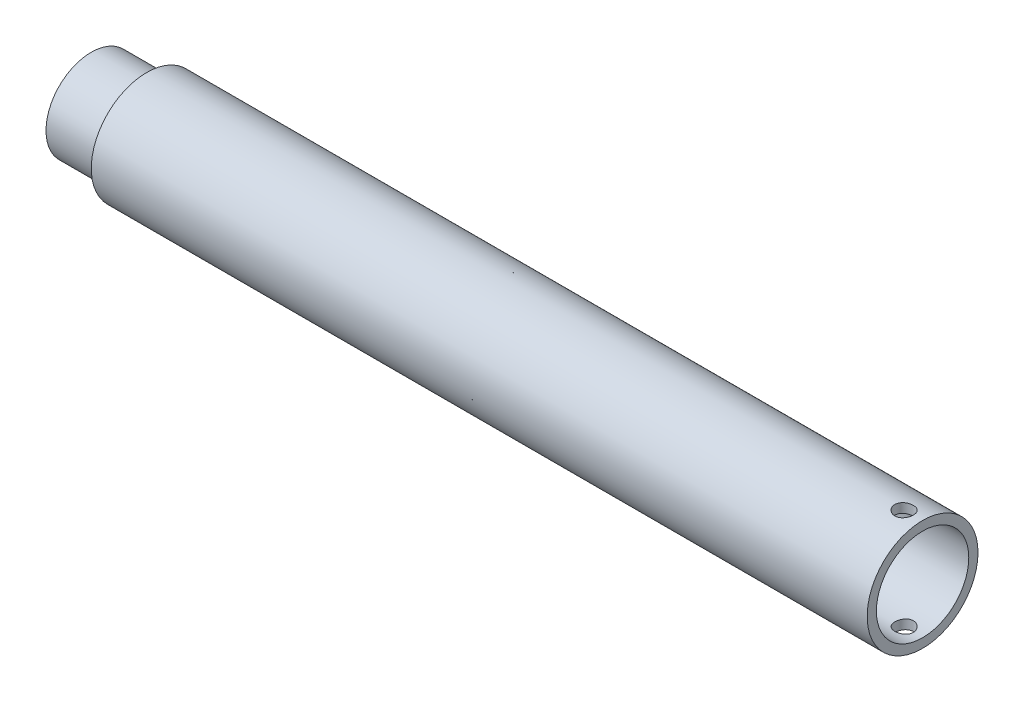
ISO-10303-21;
HEADER;
FILE_DESCRIPTION(('STEP AP214'),'2;1');
FILE_NAME('part.step','',(''),(''),'','','');
FILE_SCHEMA(('AUTOMOTIVE_DESIGN { 1 0 10303 214 1 1 1 1 }'));
ENDSEC;
DATA;
#1=APPLICATION_CONTEXT('core data for automotive mechanical design processes');
#2=APPLICATION_PROTOCOL_DEFINITION('international standard','automotive_design',2000,#1);
#3=PRODUCT_CONTEXT('',#1,'mechanical');
#4=PRODUCT('Part','Part','',(#3));
#5=PRODUCT_RELATED_PRODUCT_CATEGORY('part','',(#4));
#6=PRODUCT_DEFINITION_FORMATION('','',#4);
#7=PRODUCT_DEFINITION_CONTEXT('part definition',#1,'design');
#8=PRODUCT_DEFINITION('design','',#6,#7);
#9=PRODUCT_DEFINITION_SHAPE('','',#8);
#10=(LENGTH_UNIT() NAMED_UNIT(*) SI_UNIT(.MILLI.,.METRE.));
#11=(NAMED_UNIT(*) PLANE_ANGLE_UNIT() SI_UNIT($,.RADIAN.));
#12=(NAMED_UNIT(*) SI_UNIT($,.STERADIAN.) SOLID_ANGLE_UNIT());
#13=UNCERTAINTY_MEASURE_WITH_UNIT(LENGTH_MEASURE(1.E-05),#10,'distance_accuracy_value','');
#14=(GEOMETRIC_REPRESENTATION_CONTEXT(3) GLOBAL_UNCERTAINTY_ASSIGNED_CONTEXT((#13)) GLOBAL_UNIT_ASSIGNED_CONTEXT((#10,
#11,#12)) REPRESENTATION_CONTEXT('',''));
#15=CARTESIAN_POINT('',(0.,0.,0.));
#16=DIRECTION('',(0.,0.,1.));
#17=DIRECTION('',(1.,0.,0.));
#18=AXIS2_PLACEMENT_3D('',#15,#16,#17);
#19=CARTESIAN_POINT('',(0.,0.,0.));
#20=DIRECTION('',(-1.,0.,0.));
#21=DIRECTION('',(0.,0.,1.));
#22=AXIS2_PLACEMENT_3D('',#19,#20,#21);
#23=PLANE('',#22);
#24=CARTESIAN_POINT('',(0.,0.,0.));
#25=DIRECTION('',(-1.,0.,0.));
#26=DIRECTION('',(0.,0.,1.));
#27=AXIS2_PLACEMENT_3D('',#24,#25,#26);
#28=CIRCLE('',#27,12.25);
#29=CARTESIAN_POINT('',(0.,0.,12.25));
#30=VERTEX_POINT('',#29);
#31=EDGE_CURVE('E11',#30,#30,#28,.F.);
#32=ORIENTED_EDGE('',*,*,#31,.T.);
#33=EDGE_LOOP('',(#32));
#34=FACE_BOUND('',#33,.T.);
#35=CARTESIAN_POINT('',(0.,0.,0.));
#36=DIRECTION('',(1.,0.,0.));
#37=DIRECTION('',(0.,0.,-1.));
#38=AXIS2_PLACEMENT_3D('',#35,#36,#37);
#39=CIRCLE('',#38,15.);
#40=CARTESIAN_POINT('',(0.,0.,-15.));
#41=VERTEX_POINT('',#40);
#42=EDGE_CURVE('E78',#41,#41,#39,.T.);
#43=ORIENTED_EDGE('',*,*,#42,.F.);
#44=EDGE_LOOP('',(#43));
#45=FACE_BOUND('',#44,.T.);
#46=ADVANCED_FACE('F47',(#34,#45),#23,.T.);
#47=CARTESIAN_POINT('',(5.,0.,0.));
#48=DIRECTION('',(-1.,0.,0.));
#49=DIRECTION('',(0.,0.,1.));
#50=AXIS2_PLACEMENT_3D('',#47,#48,#49);
#51=CYLINDRICAL_SURFACE('',#50,12.25);
#52=ORIENTED_EDGE('',*,*,#31,.F.);
#53=EDGE_LOOP('',(#52));
#54=FACE_BOUND('',#53,.T.);
#55=CARTESIAN_POINT('',(-15.,0.,0.));
#56=DIRECTION('',(-1.,0.,0.));
#57=DIRECTION('',(0.,0.,1.));
#58=AXIS2_PLACEMENT_3D('',#55,#56,#57);
#59=CIRCLE('',#58,12.25);
#60=CARTESIAN_POINT('',(-15.,0.,12.25));
#61=VERTEX_POINT('',#60);
#62=EDGE_CURVE('E59',#61,#61,#59,.T.);
#63=ORIENTED_EDGE('',*,*,#62,.F.);
#64=EDGE_LOOP('',(#63));
#65=FACE_BOUND('',#64,.T.);
#66=ADVANCED_FACE('F51',(#54,#65),#51,.T.);
#67=CARTESIAN_POINT('',(-15.,0.,0.));
#68=DIRECTION('',(-1.,0.,0.));
#69=DIRECTION('',(0.,0.,1.));
#70=AXIS2_PLACEMENT_3D('',#67,#68,#69);
#71=PLANE('',#70);
#72=CARTESIAN_POINT('',(-15.,0.,0.));
#73=DIRECTION('',(-1.,0.,0.));
#74=DIRECTION('',(0.,0.,1.));
#75=AXIS2_PLACEMENT_3D('',#72,#73,#74);
#76=CIRCLE('',#75,10.);
#77=CARTESIAN_POINT('',(-15.,0.,10.));
#78=VERTEX_POINT('',#77);
#79=EDGE_CURVE('E61',#78,#78,#76,.T.);
#80=ORIENTED_EDGE('',*,*,#79,.F.);
#81=EDGE_LOOP('',(#80));
#82=FACE_BOUND('',#81,.T.);
#83=ORIENTED_EDGE('',*,*,#62,.T.);
#84=EDGE_LOOP('',(#83));
#85=FACE_BOUND('',#84,.T.);
#86=ADVANCED_FACE('F142',(#82,#85),#71,.T.);
#87=CARTESIAN_POINT('',(5.,0.,0.));
#88=DIRECTION('',(-1.,0.,0.));
#89=DIRECTION('',(0.,0.,1.));
#90=AXIS2_PLACEMENT_3D('',#87,#88,#89);
#91=CYLINDRICAL_SURFACE('',#90,10.);
#92=ORIENTED_EDGE('',*,*,#79,.T.);
#93=EDGE_LOOP('',(#92));
#94=FACE_BOUND('',#93,.T.);
#95=CARTESIAN_POINT('',(10.,0.,0.));
#96=DIRECTION('',(-1.,0.,0.));
#97=DIRECTION('',(0.,0.,1.));
#98=AXIS2_PLACEMENT_3D('',#95,#96,#97);
#99=CIRCLE('',#98,10.);
#100=CARTESIAN_POINT('',(10.,0.,10.));
#101=VERTEX_POINT('',#100);
#102=EDGE_CURVE('E52',#101,#101,#99,.T.);
#103=ORIENTED_EDGE('',*,*,#102,.F.);
#104=EDGE_LOOP('',(#103));
#105=FACE_BOUND('',#104,.T.);
#106=ADVANCED_FACE('F138',(#94,#105),#91,.F.);
#107=CARTESIAN_POINT('',(210.,0.,0.));
#108=DIRECTION('',(-1.,0.,0.));
#109=DIRECTION('',(0.,0.,1.));
#110=AXIS2_PLACEMENT_3D('',#107,#108,#109);
#111=CYLINDRICAL_SURFACE('',#110,12.5);
#112=CARTESIAN_POINT('',(205.,12.2474487139159,-2.5));
#113=CARTESIAN_POINT('',(204.861089061272,12.2474514756662,-2.49999486468817));
#114=CARTESIAN_POINT('',(204.722113441667,12.2498377067175,-2.48838292929536));
#115=CARTESIAN_POINT('',(204.448093737142,12.2591107826219,-2.4422807089571));
#116=CARTESIAN_POINT('',(204.31305288841,12.2660012286197,-2.40777211767623));
#117=CARTESIAN_POINT('',(204.050906741614,12.2834718430464,-2.31698945654936));
#118=CARTESIAN_POINT('',(203.923793696169,12.2940483405269,-2.26073703538156));
#119=CARTESIAN_POINT('',(203.680812888258,12.3176949870165,-2.12812276917627));
#120=CARTESIAN_POINT('',(203.564944498655,12.3307649968365,-2.05176204650288));
#121=CARTESIAN_POINT('',(203.346097490365,12.3581324923563,-1.87994768913359));
#122=CARTESIAN_POINT('',(203.24330103029,12.3724434459312,-1.7842641397833));
#123=CARTESIAN_POINT('',(203.055106166053,12.400561807565,-1.57701697255328));
#124=CARTESIAN_POINT('',(202.969708981457,12.4143691802708,-1.46545224244496));
#125=CARTESIAN_POINT('',(202.818029955929,12.4400699104391,-1.22840338981063));
#126=CARTESIAN_POINT('',(202.751921215458,12.4519455360388,-1.10280641918052));
#127=CARTESIAN_POINT('',(202.64181265738,12.4722934220908,-0.842010375968175));
#128=CARTESIAN_POINT('',(202.597810770247,12.480766001103,-0.706812203551388));
#129=CARTESIAN_POINT('',(202.533732015951,12.4932580172105,-0.432541933196249));
#130=CARTESIAN_POINT('',(202.513347556072,12.4973346572032,-0.293544348037046));
#131=CARTESIAN_POINT('',(202.496122620404,12.5007730295901,-0.0140464210938512));
#132=CARTESIAN_POINT('',(202.499279875885,12.500135216319,0.126453774579596));
#133=CARTESIAN_POINT('',(202.528815450539,12.4942608717129,0.402855001858956));
#134=CARTESIAN_POINT('',(202.55486244292,12.489089959146,0.538793035746158));
#135=CARTESIAN_POINT('',(202.628912581147,12.4748044289852,0.804329066450734));
#136=CARTESIAN_POINT('',(202.67691660548,12.465689653601,0.933926809367804));
#137=CARTESIAN_POINT('',(202.793825100368,12.444432400499,1.1840486580022));
#138=CARTESIAN_POINT('',(202.862859377762,12.4322712043806,1.30451043533474));
#139=CARTESIAN_POINT('',(203.019772693091,12.4062617368446,1.53226261464938));
#140=CARTESIAN_POINT('',(203.107653899426,12.3924132713806,1.63955149881249));
#141=CARTESIAN_POINT('',(203.301584055271,12.3642741091115,1.83987857763363));
#142=CARTESIAN_POINT('',(203.407922966824,12.3499799114379,1.93263579143407));
#143=CARTESIAN_POINT('',(203.634791106127,12.322789289969,2.09904623294202));
#144=CARTESIAN_POINT('',(203.755320602208,12.3098928926137,2.17269909931937));
#145=CARTESIAN_POINT('',(204.007552079554,12.2869511868231,2.2989070370047));
#146=CARTESIAN_POINT('',(204.139277419099,12.2769120390887,2.35141661944427));
#147=CARTESIAN_POINT('',(204.40992830931,12.2609119080318,2.43347585406895));
#148=CARTESIAN_POINT('',(204.548852919048,12.2549503932107,2.4630284986416));
#149=CARTESIAN_POINT('',(204.827412144998,12.2478869816957,2.49791501509012));
#150=CARTESIAN_POINT('',(204.966993935776,12.2467036764289,2.50365464724478));
#151=CARTESIAN_POINT('',(205.245120557999,12.2491121422213,2.49184407077684));
#152=CARTESIAN_POINT('',(205.383665447797,12.2527036425097,2.4742951828061));
#153=CARTESIAN_POINT('',(205.654421600731,12.2641808123729,2.41675552018539));
#154=CARTESIAN_POINT('',(205.786680857589,12.2720249753624,2.37698155209825));
#155=CARTESIAN_POINT('',(206.042658197572,12.2910872337916,2.27635258827129));
#156=CARTESIAN_POINT('',(206.166375576089,12.3023056071567,2.21549585593293));
#157=CARTESIAN_POINT('',(206.403532774875,12.327035149051,2.07351035553898));
#158=CARTESIAN_POINT('',(206.516817615752,12.3405742966226,1.99212769495687));
#159=CARTESIAN_POINT('',(206.728270780002,12.3683430956659,1.81173893053177));
#160=CARTESIAN_POINT('',(206.826437545623,12.3825728180955,1.71273101286133));
#161=CARTESIAN_POINT('',(207.006406397964,12.4103836467304,1.49808068374472));
#162=CARTESIAN_POINT('',(207.087934136625,12.4239514427171,1.38220624732407));
#163=CARTESIAN_POINT('',(207.230364703749,12.4486781907155,1.13816974158689));
#164=CARTESIAN_POINT('',(207.291268398362,12.4598372438803,1.01000818858377));
#165=CARTESIAN_POINT('',(207.390322179367,12.4784323515267,0.745756702060042));
#166=CARTESIAN_POINT('',(207.428601295566,12.4858894785651,0.609716683695206));
#167=CARTESIAN_POINT('',(207.48172811916,12.4963308984415,0.33297363669979));
#168=CARTESIAN_POINT('',(207.496578648689,12.4993157299962,0.192271171778041));
#169=CARTESIAN_POINT('',(207.502317452407,12.5004635113529,-0.0871822347590421));
#170=CARTESIAN_POINT('',(207.493618201141,12.4987094637332,-0.225924530353726));
#171=CARTESIAN_POINT('',(207.45341512363,12.4907510890085,-0.499927578289116));
#172=CARTESIAN_POINT('',(207.42191158413,12.4845468178608,-0.635188374384297));
#173=CARTESIAN_POINT('',(207.337177519771,12.468387459123,-0.898131874362646));
#174=CARTESIAN_POINT('',(207.283996554673,12.4584409311904,-1.02583110810039));
#175=CARTESIAN_POINT('',(207.157469396672,12.435868053092,-1.27055305046515));
#176=CARTESIAN_POINT('',(207.084121610239,12.4232414911747,-1.3875749144196));
#177=CARTESIAN_POINT('',(206.917951532347,12.3964399789185,-1.60965972526477));
#178=CARTESIAN_POINT('',(206.824834159041,12.3822433354475,-1.71449929028708));
#179=CARTESIAN_POINT('',(206.622374399753,12.3540305726966,-1.90720654439625));
#180=CARTESIAN_POINT('',(206.5130281763,12.340014496968,-1.99507020802227));
#181=CARTESIAN_POINT('',(206.279801708274,12.3135835683483,-2.15223054862494));
#182=CARTESIAN_POINT('',(206.155777597197,12.3011875892806,-2.22131703654521));
#183=CARTESIAN_POINT('',(205.89766806685,12.2796309281603,-2.33756012316556));
#184=CARTESIAN_POINT('',(205.763591903282,12.2704673131246,-2.3847366149354));
#185=CARTESIAN_POINT('',(205.524343861393,12.2582420284461,-2.44667284964413));
#186=CARTESIAN_POINT('',(205.420536451215,12.2542196228652,-2.4666347463092));
#187=CARTESIAN_POINT('',(205.211165113622,12.2488219614771,-2.49330004489927));
#188=CARTESIAN_POINT('',(205.105601246889,12.2474466144105,-2.5000039039066));
#189=CARTESIAN_POINT('',(205.,12.2474487139159,-2.5));
#190=B_SPLINE_CURVE_WITH_KNOTS('',3,(#112,#113,#114,#115,#116,#117,#118,#119,#120,#121,#122,
#123,#124,#125,#126,#127,#128,#129,#130,#131,#132,#133,#134,#135,#136,#137,#138,#139,#140,#141,
#142,#143,#144,#145,#146,#147,#148,#149,#150,#151,#152,#153,#154,#155,#156,#157,#158,#159,#160,
#161,#162,#163,#164,#165,#166,#167,#168,#169,#170,#171,#172,#173,#174,#175,#176,#177,#178,#179,
#180,#181,#182,#183,#184,#185,#186,#187,#188,#189),.UNSPECIFIED.,.T.,.F.,(4,2,2,2,2,2,2,2,2,2,2,
2,2,2,2,2,2,2,2,2,2,2,2,2,2,2,2,2,2,2,2,2,2,2,2,2,2,2,4),(0.,0.416346159673539,
0.833025598210731,1.24929124485145,1.66553366214964,2.08705631371092,2.50860850088555,
2.93383501093626,3.35902170616398,3.77860622207699,4.19815030290619,4.61171974083841,
5.02530572684374,5.44149810555756,5.85773839425164,6.28123366906206,6.70473695306801,
7.12914657931941,7.55350087540059,7.97059394511484,8.38766336321051,8.80073354458296,
9.21383775885995,9.63232649436305,10.0508583217552,10.4758150433362,10.9007539157526,
11.3232453394662,11.7456858672907,12.1607754353671,12.5758597841689,12.9900004268863,
13.4041738033671,13.8250288006399,14.2459834722445,14.6714724644901,15.0965743772549,
15.413095090954,15.729604892137),.UNSPECIFIED.);
#191=CARTESIAN_POINT('',(205.,12.2474487139159,-2.5));
#192=VERTEX_POINT('',#191);
#193=EDGE_CURVE('E100',#192,#192,#190,.T.);
#194=ORIENTED_EDGE('',*,*,#193,.T.);
#195=EDGE_LOOP('',(#194));
#196=FACE_BOUND('',#195,.T.);
#197=CARTESIAN_POINT('',(210.,0.,0.));
#198=DIRECTION('',(1.,0.,0.));
#199=DIRECTION('',(0.,0.,-1.));
#200=AXIS2_PLACEMENT_3D('',#197,#198,#199);
#201=CIRCLE('',#200,12.5);
#202=CARTESIAN_POINT('',(210.,0.,-12.5));
#203=VERTEX_POINT('',#202);
#204=EDGE_CURVE('E86',#203,#203,#201,.T.);
#205=ORIENTED_EDGE('',*,*,#204,.T.);
#206=EDGE_LOOP('',(#205));
#207=FACE_BOUND('',#206,.T.);
#208=CARTESIAN_POINT('',(205.,-12.2474487139159,-2.5));
#209=CARTESIAN_POINT('',(205.138910938728,-12.2474514756662,-2.49999486468817));
#210=CARTESIAN_POINT('',(205.277886558333,-12.2498377067175,-2.48838292929536));
#211=CARTESIAN_POINT('',(205.551906262858,-12.2591107826219,-2.4422807089571));
#212=CARTESIAN_POINT('',(205.68694711159,-12.2660012286197,-2.40777211767623));
#213=CARTESIAN_POINT('',(205.949093258385,-12.2834718430464,-2.31698945654936));
#214=CARTESIAN_POINT('',(206.076206303831,-12.2940483405269,-2.26073703538156));
#215=CARTESIAN_POINT('',(206.319187111742,-12.3176949870165,-2.12812276917627));
#216=CARTESIAN_POINT('',(206.435055501345,-12.3307649968365,-2.05176204650288));
#217=CARTESIAN_POINT('',(206.653902509635,-12.3581324923563,-1.87994768913359));
#218=CARTESIAN_POINT('',(206.75669896971,-12.3724434459312,-1.7842641397833));
#219=CARTESIAN_POINT('',(206.944893833947,-12.400561807565,-1.57701697255328));
#220=CARTESIAN_POINT('',(207.030291018543,-12.4143691802708,-1.46545224244496));
#221=CARTESIAN_POINT('',(207.181970044071,-12.440069910439,-1.22840338981064));
#222=CARTESIAN_POINT('',(207.248078784542,-12.4519455360388,-1.10280641918053));
#223=CARTESIAN_POINT('',(207.35818734262,-12.4722934220908,-0.84201037596819));
#224=CARTESIAN_POINT('',(207.402189229752,-12.480766001103,-0.706812203551395));
#225=CARTESIAN_POINT('',(207.466267984049,-12.4932580172105,-0.43254193319625));
#226=CARTESIAN_POINT('',(207.486652443927,-12.4973346572032,-0.29354434803705));
#227=CARTESIAN_POINT('',(207.503877379596,-12.5007730295901,-0.0140464210938544));
#228=CARTESIAN_POINT('',(207.500720124115,-12.500135216319,0.126453774579596));
#229=CARTESIAN_POINT('',(207.471184549461,-12.4942608717129,0.402855001858959));
#230=CARTESIAN_POINT('',(207.44513755708,-12.489089959146,0.538793035746161));
#231=CARTESIAN_POINT('',(207.371087418853,-12.4748044289852,0.804329066450737));
#232=CARTESIAN_POINT('',(207.32308339452,-12.465689653601,0.933926809367807));
#233=CARTESIAN_POINT('',(207.206174899632,-12.444432400499,1.18404865800221));
#234=CARTESIAN_POINT('',(207.137140622238,-12.4322712043806,1.30451043533474));
#235=CARTESIAN_POINT('',(206.980227306908,-12.4062617368446,1.53226261464938));
#236=CARTESIAN_POINT('',(206.892346100574,-12.3924132713806,1.63955149881249));
#237=CARTESIAN_POINT('',(206.698415944729,-12.3642741091115,1.83987857763363));
#238=CARTESIAN_POINT('',(206.592077033176,-12.3499799114379,1.93263579143407));
#239=CARTESIAN_POINT('',(206.365208893873,-12.322789289969,2.09904623294202));
#240=CARTESIAN_POINT('',(206.244679397792,-12.3098928926137,2.17269909931937));
#241=CARTESIAN_POINT('',(205.992447920445,-12.2869511868231,2.2989070370047));
#242=CARTESIAN_POINT('',(205.860722580901,-12.2769120390887,2.35141661944427));
#243=CARTESIAN_POINT('',(205.59007169069,-12.2609119080318,2.43347585406895));
#244=CARTESIAN_POINT('',(205.451147080952,-12.2549503932107,2.4630284986416));
#245=CARTESIAN_POINT('',(205.172587855002,-12.2478869816957,2.49791501509012));
#246=CARTESIAN_POINT('',(205.033006064224,-12.2467036764289,2.50365464724478));
#247=CARTESIAN_POINT('',(204.754879442001,-12.2491121422213,2.49184407077684));
#248=CARTESIAN_POINT('',(204.616334552203,-12.2527036425097,2.4742951828061));
#249=CARTESIAN_POINT('',(204.345578399269,-12.2641808123729,2.41675552018539));
#250=CARTESIAN_POINT('',(204.213319142411,-12.2720249753624,2.37698155209825));
#251=CARTESIAN_POINT('',(203.957341802428,-12.2910872337916,2.27635258827129));
#252=CARTESIAN_POINT('',(203.833624423911,-12.3023056071567,2.21549585593294));
#253=CARTESIAN_POINT('',(203.596467225125,-12.327035149051,2.07351035553899));
#254=CARTESIAN_POINT('',(203.483182384248,-12.3405742966226,1.99212769495689));
#255=CARTESIAN_POINT('',(203.271729219998,-12.3683430956659,1.81173893053179));
#256=CARTESIAN_POINT('',(203.173562454377,-12.3825728180955,1.71273101286135));
#257=CARTESIAN_POINT('',(202.993593602036,-12.4103836467304,1.49808068374472));
#258=CARTESIAN_POINT('',(202.912065863375,-12.4239514427171,1.38220624732407));
#259=CARTESIAN_POINT('',(202.769635296251,-12.4486781907155,1.13816974158689));
#260=CARTESIAN_POINT('',(202.708731601638,-12.4598372438803,1.01000818858377));
#261=CARTESIAN_POINT('',(202.609677820633,-12.4784323515267,0.745756702060042));
#262=CARTESIAN_POINT('',(202.571398704434,-12.4858894785651,0.609716683695206));
#263=CARTESIAN_POINT('',(202.51827188084,-12.4963308984415,0.33297363669979));
#264=CARTESIAN_POINT('',(202.503421351311,-12.4993157299962,0.192271171778041));
#265=CARTESIAN_POINT('',(202.497682547593,-12.5004635113529,-0.0871822347590422));
#266=CARTESIAN_POINT('',(202.506381798859,-12.4987094637332,-0.225924530353726));
#267=CARTESIAN_POINT('',(202.54658487637,-12.4907510890085,-0.499927578289116));
#268=CARTESIAN_POINT('',(202.57808841587,-12.4845468178608,-0.635188374384295));
#269=CARTESIAN_POINT('',(202.662822480229,-12.468387459123,-0.898131874362654));
#270=CARTESIAN_POINT('',(202.716003445327,-12.4584409311904,-1.02583110810041));
#271=CARTESIAN_POINT('',(202.842530603328,-12.435868053092,-1.27055305046517));
#272=CARTESIAN_POINT('',(202.915878389761,-12.4232414911747,-1.3875749144196));
#273=CARTESIAN_POINT('',(203.082048467653,-12.3964399789185,-1.60965972526478));
#274=CARTESIAN_POINT('',(203.175165840959,-12.3822433354475,-1.7144992902871));
#275=CARTESIAN_POINT('',(203.377625600247,-12.3540305726966,-1.90720654439626));
#276=CARTESIAN_POINT('',(203.4869718237,-12.340014496968,-1.99507020802228));
#277=CARTESIAN_POINT('',(203.720198291726,-12.3135835683483,-2.15223054862494));
#278=CARTESIAN_POINT('',(203.844222402803,-12.3011875892806,-2.22131703654521));
#279=CARTESIAN_POINT('',(204.10233193315,-12.2796309281603,-2.33756012316556));
#280=CARTESIAN_POINT('',(204.236408096718,-12.2704673131246,-2.3847366149354));
#281=CARTESIAN_POINT('',(204.475656138607,-12.2582420284461,-2.44667284964413));
#282=CARTESIAN_POINT('',(204.579463548785,-12.2542196228652,-2.4666347463092));
#283=CARTESIAN_POINT('',(204.788834886378,-12.2488219614771,-2.49330004489927));
#284=CARTESIAN_POINT('',(204.894398753111,-12.2474466144105,-2.5000039039066));
#285=CARTESIAN_POINT('',(205.,-12.2474487139159,-2.5));
#286=B_SPLINE_CURVE_WITH_KNOTS('',3,(#208,#209,#210,#211,#212,#213,#214,#215,#216,#217,#218,
#219,#220,#221,#222,#223,#224,#225,#226,#227,#228,#229,#230,#231,#232,#233,#234,#235,#236,#237,
#238,#239,#240,#241,#242,#243,#244,#245,#246,#247,#248,#249,#250,#251,#252,#253,#254,#255,#256,
#257,#258,#259,#260,#261,#262,#263,#264,#265,#266,#267,#268,#269,#270,#271,#272,#273,#274,#275,
#276,#277,#278,#279,#280,#281,#282,#283,#284,#285),.UNSPECIFIED.,.T.,.F.,(4,2,2,2,2,2,2,2,2,2,2,
2,2,2,2,2,2,2,2,2,2,2,2,2,2,2,2,2,2,2,2,2,2,2,2,2,2,2,4),(0.,0.416346159673539,
0.833025598210731,1.24929124485145,1.66553366214964,2.08705631371092,2.50860850088555,
2.93383501093624,3.35902170616398,3.77860622207699,4.19815030290619,4.61171974083842,
5.02530572684374,5.44149810555756,5.85773839425164,6.28123366906206,6.70473695306801,
7.1291465793194,7.55350087540059,7.97059394511483,8.38766336321051,8.80073354458296,
9.21383775885995,9.63232649436298,10.0508583217552,10.4758150433362,10.9007539157526,
11.3232453394662,11.7456858672907,12.1607754353671,12.5758597841689,12.9900004268863,
13.4041738033671,13.8250288006399,14.2459834722445,14.6714724644901,15.0965743772549,
15.413095090954,15.729604892137),.UNSPECIFIED.);
#287=CARTESIAN_POINT('',(205.,-12.2474487139159,-2.5));
#288=VERTEX_POINT('',#287);
#289=EDGE_CURVE('E91',#288,#288,#286,.T.);
#290=ORIENTED_EDGE('',*,*,#289,.T.);
#291=EDGE_LOOP('',(#290));
#292=FACE_BOUND('',#291,.T.);
#293=CARTESIAN_POINT('',(10.,0.,0.));
#294=DIRECTION('',(-1.,0.,0.));
#295=DIRECTION('',(0.,0.,1.));
#296=AXIS2_PLACEMENT_3D('',#293,#294,#295);
#297=CIRCLE('',#296,12.5);
#298=CARTESIAN_POINT('',(10.,0.,12.5));
#299=VERTEX_POINT('',#298);
#300=EDGE_CURVE('E70',#299,#299,#297,.T.);
#301=ORIENTED_EDGE('',*,*,#300,.T.);
#302=EDGE_LOOP('',(#301));
#303=FACE_BOUND('',#302,.T.);
#304=ADVANCED_FACE('F101',(#196,#207,#292,#303),#111,.F.);
#305=CARTESIAN_POINT('',(210.,0.,0.));
#306=DIRECTION('',(-1.,0.,0.));
#307=DIRECTION('',(0.,0.,1.));
#308=AXIS2_PLACEMENT_3D('',#305,#306,#307);
#309=CYLINDRICAL_SURFACE('',#308,15.);
#310=CARTESIAN_POINT('',(210.,0.,0.));
#311=DIRECTION('',(1.,0.,0.));
#312=DIRECTION('',(0.,0.,-1.));
#313=AXIS2_PLACEMENT_3D('',#310,#311,#312);
#314=CIRCLE('',#313,15.);
#315=CARTESIAN_POINT('',(210.,0.,-15.));
#316=VERTEX_POINT('',#315);
#317=EDGE_CURVE('E75',#316,#316,#314,.T.);
#318=ORIENTED_EDGE('',*,*,#317,.F.);
#319=EDGE_LOOP('',(#318));
#320=FACE_BOUND('',#319,.T.);
#321=ORIENTED_EDGE('',*,*,#42,.T.);
#322=EDGE_LOOP('',(#321));
#323=FACE_BOUND('',#322,.T.);
#324=CARTESIAN_POINT('',(205.,-14.790199457749,-2.5));
#325=CARTESIAN_POINT('',(205.139375748162,-14.790201973666,-2.49999439841982));
#326=CARTESIAN_POINT('',(205.278827606071,-14.7921909238523,-2.48830516902828));
#327=CARTESIAN_POINT('',(205.553818543263,-14.7999245720004,-2.44187742806638));
#328=CARTESIAN_POINT('',(205.689353893758,-14.8056727334637,-2.40711766030861));
#329=CARTESIAN_POINT('',(205.952492283342,-14.8202560936731,-2.31562954367049));
#330=CARTESIAN_POINT('',(206.080101848662,-14.8290887118401,-2.25891955493198));
#331=CARTESIAN_POINT('',(206.323980954718,-14.8488427210228,-2.12518649688945));
#332=CARTESIAN_POINT('',(206.440251769577,-14.8597638769423,-2.04816571350131));
#333=CARTESIAN_POINT('',(206.659312849745,-14.8825847115588,-1.87518752696653));
#334=CARTESIAN_POINT('',(206.761975131386,-14.8944921732795,-1.77906904893232));
#335=CARTESIAN_POINT('',(206.949793306862,-14.9178748066858,-1.57097200469526));
#336=CARTESIAN_POINT('',(207.034948163115,-14.9293499527174,-1.45899249914996));
#337=CARTESIAN_POINT('',(207.185814567219,-14.9506573698271,-1.22152286994835));
#338=CARTESIAN_POINT('',(207.251407007732,-14.9604794243234,-1.0959560814567));
#339=CARTESIAN_POINT('',(207.360521070531,-14.9772873695709,-0.835395621723868));
#340=CARTESIAN_POINT('',(207.404044127885,-14.9842734447266,-0.700402564078186));
#341=CARTESIAN_POINT('',(207.467392534984,-14.994567347244,-0.426143726344242));
#342=CARTESIAN_POINT('',(207.487432916005,-14.9979085311091,-0.286928886679275));
#343=CARTESIAN_POINT('',(207.503915754153,-15.0006507934278,-0.00707528552580723));
#344=CARTESIAN_POINT('',(207.500359815247,-15.0000521396931,0.133563378528886));
#345=CARTESIAN_POINT('',(207.469918648472,-14.9950085843139,0.410802185078864));
#346=CARTESIAN_POINT('',(207.443264836591,-14.990601836924,0.547428530700132));
#347=CARTESIAN_POINT('',(207.367748925753,-14.9784797877164,0.814241979611783));
#348=CARTESIAN_POINT('',(207.31888615041,-14.9707643851321,0.944428886651495));
#349=CARTESIAN_POINT('',(207.200109359685,-14.9528269851196,1.19535614778264));
#350=CARTESIAN_POINT('',(207.130099987918,-14.9425936732688,1.31605052301903));
#351=CARTESIAN_POINT('',(206.971087177365,-14.920757380715,1.54406552984663));
#352=CARTESIAN_POINT('',(206.882082201289,-14.9091542891913,1.65138507791586));
#353=CARTESIAN_POINT('',(206.686321193381,-14.885702682326,1.85097127344665));
#354=CARTESIAN_POINT('',(206.579362905099,-14.8738528973104,1.9430395022532));
#355=CARTESIAN_POINT('',(206.351412909784,-14.8513795978481,2.10795458844806));
#356=CARTESIAN_POINT('',(206.230421073317,-14.8407560947132,2.18080126853241));
#357=CARTESIAN_POINT('',(205.977608358123,-14.8219375456182,2.30524443448828));
#358=CARTESIAN_POINT('',(205.845775501908,-14.813745233026,2.35681702727923));
#359=CARTESIAN_POINT('',(205.575150927692,-14.8007618868988,2.4370298708156));
#360=CARTESIAN_POINT('',(205.436359823568,-14.7959705538832,2.46567214076794));
#361=CARTESIAN_POINT('',(205.157533843838,-14.7903895942212,2.49893188487926));
#362=CARTESIAN_POINT('',(205.017533620298,-14.7895528575867,2.50383220791243));
#363=CARTESIAN_POINT('',(204.738713328309,-14.7918503478236,2.49022270268246));
#364=CARTESIAN_POINT('',(204.599893214486,-14.7949844213185,2.47171377862467));
#365=CARTESIAN_POINT('',(204.328272240809,-14.8048268745502,2.4120523349281));
#366=CARTESIAN_POINT('',(204.195438860122,-14.8115125191835,2.37104379064639));
#367=CARTESIAN_POINT('',(203.938529833721,-14.827685730055,2.26769819019228));
#368=CARTESIAN_POINT('',(203.814454712449,-14.8371734639058,2.20535985810095));
#369=CARTESIAN_POINT('',(203.577325405594,-14.8579912839739,2.06045667322924));
#370=CARTESIAN_POINT('',(203.464383427244,-14.8693375560035,1.97771056415937));
#371=CARTESIAN_POINT('',(203.253886467305,-14.8925466667987,1.79458946570798));
#372=CARTESIAN_POINT('',(203.15633256889,-14.9044095418533,1.69421323638405));
#373=CARTESIAN_POINT('',(202.978348107271,-14.9274642211826,1.47742807032882));
#374=CARTESIAN_POINT('',(202.898106173715,-14.9386477634467,1.36086325338621));
#375=CARTESIAN_POINT('',(202.758344672995,-14.9589511243294,1.11574344794934));
#376=CARTESIAN_POINT('',(202.698824435526,-14.9680710096998,0.98718884747064));
#377=CARTESIAN_POINT('',(202.602489416045,-14.9831835816958,0.722299051501345));
#378=CARTESIAN_POINT('',(202.565575924265,-14.9891898456762,0.586000562602632));
#379=CARTESIAN_POINT('',(202.515184401036,-14.9974558316928,0.30903073487423));
#380=CARTESIAN_POINT('',(202.501704441268,-14.9997158620019,0.168359756821634));
#381=CARTESIAN_POINT('',(202.498618117688,-15.0002303788781,-0.111541275773667));
#382=CARTESIAN_POINT('',(202.508724746059,-14.9985330202419,-0.250768160602654));
#383=CARTESIAN_POINT('',(202.551903922269,-14.9914217838733,-0.525511974314694));
#384=CARTESIAN_POINT('',(202.58497634151,-14.9860079269518,-0.661028923967469));
#385=CARTESIAN_POINT('',(202.673038165544,-14.972069888274,-0.924396445918534));
#386=CARTESIAN_POINT('',(202.72800316821,-14.9635491704088,-1.05225537215382));
#387=CARTESIAN_POINT('',(202.858257936231,-14.9443275687803,-1.29698045298217));
#388=CARTESIAN_POINT('',(202.933548665062,-14.9336265816741,-1.41384608611822));
#389=CARTESIAN_POINT('',(203.10333509246,-14.9110762961641,-1.63471294552639));
#390=CARTESIAN_POINT('',(203.198040954751,-14.8992152454112,-1.73855143060275));
#391=CARTESIAN_POINT('',(203.403528307904,-14.8757630331437,-1.92896387595091));
#392=CARTESIAN_POINT('',(203.514313558913,-14.8641719354951,-2.01553378671189));
#393=CARTESIAN_POINT('',(203.74974532249,-14.8424834353391,-2.16951427091085));
#394=CARTESIAN_POINT('',(203.874484339765,-14.8323971784578,-2.23678498905769));
#395=CARTESIAN_POINT('',(204.133609235838,-14.8149921009131,-2.34931453640427));
#396=CARTESIAN_POINT('',(204.267985322677,-14.8076705172488,-2.39459535522307));
#397=CARTESIAN_POINT('',(204.502403769487,-14.7982474485649,-2.45202605312742));
#398=CARTESIAN_POINT('',(204.601026807963,-14.7952462341947,-2.46998741767138));
#399=CARTESIAN_POINT('',(204.799753484837,-14.7912213528807,-2.49397629518131));
#400=CARTESIAN_POINT('',(204.899857096324,-14.7901976500369,-2.50000402479277));
#401=CARTESIAN_POINT('',(205.,-14.790199457749,-2.5));
#402=B_SPLINE_CURVE_WITH_KNOTS('',3,(#324,#325,#326,#327,#328,#329,#330,#331,#332,#333,#334,
#335,#336,#337,#338,#339,#340,#341,#342,#343,#344,#345,#346,#347,#348,#349,#350,#351,#352,#353,
#354,#355,#356,#357,#358,#359,#360,#361,#362,#363,#364,#365,#366,#367,#368,#369,#370,#371,#372,
#373,#374,#375,#376,#377,#378,#379,#380,#381,#382,#383,#384,#385,#386,#387,#388,#389,#390,#391,
#392,#393,#394,#395,#396,#397,#398,#399,#400,#401),.UNSPECIFIED.,.T.,.F.,(4,2,2,2,2,2,2,2,2,2,2,
2,2,2,2,2,2,2,2,2,2,2,2,2,2,2,2,2,2,2,2,2,2,2,2,2,2,2,4),(0.,0.417761038927708,
0.835907519962962,1.25370499787522,1.67145547405275,2.09289159155717,2.51435267834448,
2.93832980111435,3.36227935111113,3.78231567472564,4.2023234465269,4.61817121164667,
5.03403164249531,5.45179604139423,5.86959426226763,6.29246123462123,6.71533210746017,
7.138676624986,7.56198385938072,7.98023542420404,8.39847083413972,8.81406064635487,
9.2296753229357,9.649123427627,10.0686010443069,10.4924411303538,10.9162675047669,
11.3382298441764,11.7601574591235,12.1769777626591,12.5937957321882,13.0101503983246,
13.4265248039233,13.8476699746325,14.2689137888181,14.6931372761832,15.1169356674445,
15.4171067054376,15.7172722940182),.UNSPECIFIED.);
#403=CARTESIAN_POINT('',(205.,-14.790199457749,-2.5));
#404=VERTEX_POINT('',#403);
#405=EDGE_CURVE('E116',#404,#404,#402,.T.);
#406=ORIENTED_EDGE('',*,*,#405,.F.);
#407=EDGE_LOOP('',(#406));
#408=FACE_BOUND('',#407,.T.);
#409=CARTESIAN_POINT('',(205.,14.790199457749,-2.5));
#410=CARTESIAN_POINT('',(204.860624251838,14.790201973666,-2.49999439841982));
#411=CARTESIAN_POINT('',(204.721172393928,14.7921909238523,-2.48830516902828));
#412=CARTESIAN_POINT('',(204.446181456737,14.7999245720004,-2.44187742806637));
#413=CARTESIAN_POINT('',(204.310646106242,14.8056727334637,-2.4071176603086));
#414=CARTESIAN_POINT('',(204.047507716658,14.8202560936731,-2.31562954367049));
#415=CARTESIAN_POINT('',(203.919898151338,14.8290887118401,-2.25891955493198));
#416=CARTESIAN_POINT('',(203.676019045282,14.8488427210228,-2.12518649688945));
#417=CARTESIAN_POINT('',(203.559748230423,14.8597638769423,-2.04816571350131));
#418=CARTESIAN_POINT('',(203.340687150255,14.8825847115588,-1.87518752696652));
#419=CARTESIAN_POINT('',(203.238024868614,14.8944921732795,-1.77906904893231));
#420=CARTESIAN_POINT('',(203.050206693138,14.9178748066858,-1.57097200469525));
#421=CARTESIAN_POINT('',(202.965051836885,14.9293499527174,-1.45899249914995));
#422=CARTESIAN_POINT('',(202.814185432781,14.9506573698271,-1.22152286994834));
#423=CARTESIAN_POINT('',(202.748592992268,14.9604794243234,-1.09595608145669));
#424=CARTESIAN_POINT('',(202.639478929469,14.9772873695709,-0.835395621723853));
#425=CARTESIAN_POINT('',(202.595955872115,14.9842734447266,-0.700402564078179));
#426=CARTESIAN_POINT('',(202.532607465016,14.994567347244,-0.426143726344243));
#427=CARTESIAN_POINT('',(202.512567083995,14.9979085311091,-0.286928886679275));
#428=CARTESIAN_POINT('',(202.496084245847,15.0006507934278,-0.00707528552580701));
#429=CARTESIAN_POINT('',(202.499640184753,15.0000521396931,0.133563378528887));
#430=CARTESIAN_POINT('',(202.530081351528,14.9950085843139,0.410802185078864));
#431=CARTESIAN_POINT('',(202.556735163409,14.990601836924,0.547428530700132));
#432=CARTESIAN_POINT('',(202.632251074246,14.9784797877164,0.814241979611783));
#433=CARTESIAN_POINT('',(202.681113849589,14.9707643851321,0.944428886651495));
#434=CARTESIAN_POINT('',(202.799890640315,14.9528269851196,1.19535614778264));
#435=CARTESIAN_POINT('',(202.869900012082,14.9425936732688,1.31605052301903));
#436=CARTESIAN_POINT('',(203.028912822635,14.920757380715,1.54406552984663));
#437=CARTESIAN_POINT('',(203.117917798711,14.9091542891913,1.65138507791586));
#438=CARTESIAN_POINT('',(203.313678806619,14.885702682326,1.85097127344665));
#439=CARTESIAN_POINT('',(203.420637094901,14.8738528973104,1.9430395022532));
#440=CARTESIAN_POINT('',(203.648587090216,14.8513795978481,2.10795458844806));
#441=CARTESIAN_POINT('',(203.769578926683,14.8407560947132,2.18080126853241));
#442=CARTESIAN_POINT('',(204.022391641877,14.8219375456182,2.30524443448828));
#443=CARTESIAN_POINT('',(204.154224498092,14.813745233026,2.35681702727923));
#444=CARTESIAN_POINT('',(204.424849072307,14.8007618868988,2.4370298708156));
#445=CARTESIAN_POINT('',(204.563640176432,14.7959705538832,2.46567214076794));
#446=CARTESIAN_POINT('',(204.842466156162,14.7903895942212,2.49893188487926));
#447=CARTESIAN_POINT('',(204.982466379702,14.7895528575867,2.50383220791243));
#448=CARTESIAN_POINT('',(205.261286671691,14.7918503478236,2.49022270268246));
#449=CARTESIAN_POINT('',(205.400106785514,14.7949844213185,2.47171377862466));
#450=CARTESIAN_POINT('',(205.671727759191,14.8048268745502,2.4120523349281));
#451=CARTESIAN_POINT('',(205.804561139878,14.8115125191835,2.37104379064639));
#452=CARTESIAN_POINT('',(206.061470166279,14.827685730055,2.26769819019229));
#453=CARTESIAN_POINT('',(206.185545287551,14.8371734639058,2.20535985810095));
#454=CARTESIAN_POINT('',(206.422674594406,14.8579912839739,2.06045667322924));
#455=CARTESIAN_POINT('',(206.535616572756,14.8693375560035,1.97771056415937));
#456=CARTESIAN_POINT('',(206.746113532695,14.8925466667987,1.79458946570798));
#457=CARTESIAN_POINT('',(206.84366743111,14.9044095418533,1.69421323638405));
#458=CARTESIAN_POINT('',(207.021651892729,14.9274642211826,1.47742807032882));
#459=CARTESIAN_POINT('',(207.101893826284,14.9386477634467,1.36086325338621));
#460=CARTESIAN_POINT('',(207.241655327005,14.9589511243294,1.11574344794934));
#461=CARTESIAN_POINT('',(207.301175564474,14.9680710096998,0.98718884747064));
#462=CARTESIAN_POINT('',(207.397510583955,14.9831835816958,0.722299051501342));
#463=CARTESIAN_POINT('',(207.434424075735,14.9891898456762,0.586000562602626));
#464=CARTESIAN_POINT('',(207.484815598964,14.9974558316928,0.309030734874224));
#465=CARTESIAN_POINT('',(207.498295558732,14.9997158620019,0.168359756821631));
#466=CARTESIAN_POINT('',(207.501381882312,15.0002303788781,-0.111541275773667));
#467=CARTESIAN_POINT('',(207.491275253941,14.9985330202419,-0.250768160602654));
#468=CARTESIAN_POINT('',(207.448096077731,14.9914217838733,-0.525511974314694));
#469=CARTESIAN_POINT('',(207.41502365849,14.9860079269518,-0.66102892396747));
#470=CARTESIAN_POINT('',(207.326961834456,14.972069888274,-0.924396445918526));
#471=CARTESIAN_POINT('',(207.27199683179,14.9635491704088,-1.0522553721538));
#472=CARTESIAN_POINT('',(207.141742063769,14.9443275687803,-1.29698045298215));
#473=CARTESIAN_POINT('',(207.066451334938,14.9336265816741,-1.41384608611821));
#474=CARTESIAN_POINT('',(206.896664907539,14.9110762961641,-1.63471294552638));
#475=CARTESIAN_POINT('',(206.801959045249,14.8992152454112,-1.73855143060272));
#476=CARTESIAN_POINT('',(206.596471692096,14.8757630331437,-1.92896387595088));
#477=CARTESIAN_POINT('',(206.485686441087,14.8641719354951,-2.01553378671188));
#478=CARTESIAN_POINT('',(206.25025467751,14.8424834353391,-2.16951427091085));
#479=CARTESIAN_POINT('',(206.125515660234,14.8323971784578,-2.23678498905769));
#480=CARTESIAN_POINT('',(205.866390764162,14.8149921009131,-2.34931453640427));
#481=CARTESIAN_POINT('',(205.732014677323,14.8076705172488,-2.39459535522307));
#482=CARTESIAN_POINT('',(205.497596230513,14.7982474485649,-2.45202605312742));
#483=CARTESIAN_POINT('',(205.398973192037,14.7952462341947,-2.46998741767138));
#484=CARTESIAN_POINT('',(205.200246515163,14.7912213528807,-2.49397629518131));
#485=CARTESIAN_POINT('',(205.100142903676,14.7901976500369,-2.50000402479277));
#486=CARTESIAN_POINT('',(205.,14.790199457749,-2.5));
#487=B_SPLINE_CURVE_WITH_KNOTS('',3,(#409,#410,#411,#412,#413,#414,#415,#416,#417,#418,#419,
#420,#421,#422,#423,#424,#425,#426,#427,#428,#429,#430,#431,#432,#433,#434,#435,#436,#437,#438,
#439,#440,#441,#442,#443,#444,#445,#446,#447,#448,#449,#450,#451,#452,#453,#454,#455,#456,#457,
#458,#459,#460,#461,#462,#463,#464,#465,#466,#467,#468,#469,#470,#471,#472,#473,#474,#475,#476,
#477,#478,#479,#480,#481,#482,#483,#484,#485,#486),.UNSPECIFIED.,.T.,.F.,(4,2,2,2,2,2,2,2,2,2,2,
2,2,2,2,2,2,2,2,2,2,2,2,2,2,2,2,2,2,2,2,2,2,2,2,2,2,2,4),(0.,0.417761038927736,
0.835907519962962,1.25370499787522,1.67145547405275,2.09289159155718,2.51435267834448,
2.93832980111437,3.36227935111112,3.78231567472564,4.2023234465269,4.61817121164667,
5.03403164249531,5.45179604139423,5.86959426226762,6.29246123462123,6.71533210746016,
7.138676624986,7.56198385938072,7.98023542420403,8.39847083413972,8.81406064635487,
9.2296753229357,9.64912342762699,10.0686010443069,10.4924411303538,10.9162675047669,
11.3382298441764,11.7601574591235,12.1769777626591,12.5937957321882,13.0101503983245,
13.4265248039233,13.8476699746325,14.2689137888181,14.6931372761832,15.1169356674445,
15.4171067054376,15.7172722940182),.UNSPECIFIED.);
#488=CARTESIAN_POINT('',(205.,14.790199457749,-2.5));
#489=VERTEX_POINT('',#488);
#490=EDGE_CURVE('E124',#489,#489,#487,.T.);
#491=ORIENTED_EDGE('',*,*,#490,.F.);
#492=EDGE_LOOP('',(#491));
#493=FACE_BOUND('',#492,.T.);
#494=ADVANCED_FACE('F130',(#320,#323,#408,#493),#309,.T.);
#495=CARTESIAN_POINT('',(210.,0.,0.));
#496=DIRECTION('',(1.,0.,0.));
#497=DIRECTION('',(0.,0.,-1.));
#498=AXIS2_PLACEMENT_3D('',#495,#496,#497);
#499=PLANE('',#498);
#500=ORIENTED_EDGE('',*,*,#317,.T.);
#501=EDGE_LOOP('',(#500));
#502=FACE_BOUND('',#501,.T.);
#503=ORIENTED_EDGE('',*,*,#204,.F.);
#504=EDGE_LOOP('',(#503));
#505=FACE_BOUND('',#504,.T.);
#506=ADVANCED_FACE('F131',(#502,#505),#499,.T.);
#507=CARTESIAN_POINT('',(205.,300.,0.));
#508=DIRECTION('',(0.,-1.,0.));
#509=DIRECTION('',(0.,0.,-1.));
#510=AXIS2_PLACEMENT_3D('',#507,#508,#509);
#511=CYLINDRICAL_SURFACE('',#510,2.5);
#512=ORIENTED_EDGE('',*,*,#289,.F.);
#513=EDGE_LOOP('',(#512));
#514=FACE_BOUND('',#513,.T.);
#515=ORIENTED_EDGE('',*,*,#405,.T.);
#516=EDGE_LOOP('',(#515));
#517=FACE_BOUND('',#516,.T.);
#518=ADVANCED_FACE('F109',(#514,#517),#511,.F.);
#519=ORIENTED_EDGE('',*,*,#193,.F.);
#520=EDGE_LOOP('',(#519));
#521=FACE_BOUND('',#520,.T.);
#522=ORIENTED_EDGE('',*,*,#490,.T.);
#523=EDGE_LOOP('',(#522));
#524=FACE_BOUND('',#523,.T.);
#525=ADVANCED_FACE('F106',(#521,#524),#511,.F.);
#526=CARTESIAN_POINT('',(10.,0.,0.));
#527=DIRECTION('',(-1.,0.,0.));
#528=DIRECTION('',(0.,0.,1.));
#529=AXIS2_PLACEMENT_3D('',#526,#527,#528);
#530=PLANE('',#529);
#531=ORIENTED_EDGE('',*,*,#102,.T.);
#532=EDGE_LOOP('',(#531));
#533=FACE_BOUND('',#532,.T.);
#534=ORIENTED_EDGE('',*,*,#300,.F.);
#535=EDGE_LOOP('',(#534));
#536=FACE_BOUND('',#535,.T.);
#537=ADVANCED_FACE('F107',(#533,#536),#530,.F.);
#538=CLOSED_SHELL('',(#46,#66,#86,#106,#304,#494,#506,#518,#525,#537));
#539=MANIFOLD_SOLID_BREP('B2',#538);
#540=ADVANCED_BREP_SHAPE_REPRESENTATION('',(#18,#539),#14);
#541=SHAPE_DEFINITION_REPRESENTATION(#9,#540);
ENDSEC;
END-ISO-10303-21;
